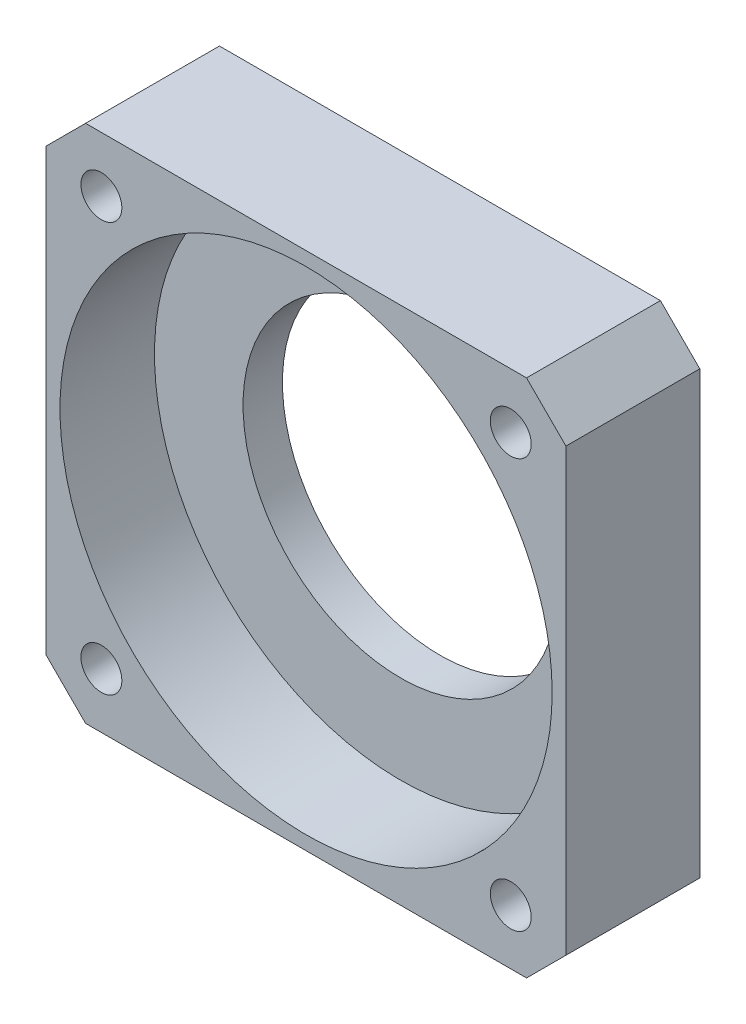
ISO-10303-21;
HEADER;
FILE_DESCRIPTION(('STEP AP214'),'2;1');
FILE_NAME('part.step','',(''),(''),'','','');
FILE_SCHEMA(('AUTOMOTIVE_DESIGN { 1 0 10303 214 1 1 1 1 }'));
ENDSEC;
DATA;
#1=APPLICATION_CONTEXT('core data for automotive mechanical design processes');
#2=APPLICATION_PROTOCOL_DEFINITION('international standard','automotive_design',2000,#1);
#3=PRODUCT_CONTEXT('',#1,'mechanical');
#4=PRODUCT('Part','Part','',(#3));
#5=PRODUCT_RELATED_PRODUCT_CATEGORY('part','',(#4));
#6=PRODUCT_DEFINITION_FORMATION('','',#4);
#7=PRODUCT_DEFINITION_CONTEXT('part definition',#1,'design');
#8=PRODUCT_DEFINITION('design','',#6,#7);
#9=PRODUCT_DEFINITION_SHAPE('','',#8);
#10=(LENGTH_UNIT() NAMED_UNIT(*) SI_UNIT(.MILLI.,.METRE.));
#11=(NAMED_UNIT(*) PLANE_ANGLE_UNIT() SI_UNIT($,.RADIAN.));
#12=(NAMED_UNIT(*) SI_UNIT($,.STERADIAN.) SOLID_ANGLE_UNIT());
#13=UNCERTAINTY_MEASURE_WITH_UNIT(LENGTH_MEASURE(1.E-05),#10,'distance_accuracy_value','');
#14=(GEOMETRIC_REPRESENTATION_CONTEXT(3) GLOBAL_UNCERTAINTY_ASSIGNED_CONTEXT((#13)) GLOBAL_UNIT_ASSIGNED_CONTEXT((#10,
#11,#12)) REPRESENTATION_CONTEXT('',''));
#15=CARTESIAN_POINT('',(0.,0.,0.));
#16=DIRECTION('',(0.,0.,1.));
#17=DIRECTION('',(1.,0.,0.));
#18=AXIS2_PLACEMENT_3D('',#15,#16,#17);
#19=CARTESIAN_POINT('',(20.955,20.955,10.795));
#20=DIRECTION('',(0.,0.,-1.));
#21=DIRECTION('',(-1.,0.,0.));
#22=AXIS2_PLACEMENT_3D('',#19,#20,#21);
#23=CYLINDRICAL_SURFACE('',#22,12.7);
#24=CARTESIAN_POINT('',(20.955,20.955,0.));
#25=DIRECTION('',(0.,0.,1.));
#26=DIRECTION('',(1.,0.,0.));
#27=AXIS2_PLACEMENT_3D('',#24,#25,#26);
#28=CIRCLE('',#27,12.7);
#29=CARTESIAN_POINT('',(33.655,20.955,0.));
#30=VERTEX_POINT('',#29);
#31=EDGE_CURVE('E187',#30,#30,#28,.T.);
#32=ORIENTED_EDGE('',*,*,#31,.F.);
#33=EDGE_LOOP('',(#32));
#34=FACE_BOUND('',#33,.T.);
#35=CARTESIAN_POINT('',(20.955,20.955,3.175));
#36=DIRECTION('',(0.,0.,1.));
#37=DIRECTION('',(1.,0.,0.));
#38=AXIS2_PLACEMENT_3D('',#35,#36,#37);
#39=CIRCLE('',#38,12.7);
#40=CARTESIAN_POINT('',(33.655,20.955,3.175));
#41=VERTEX_POINT('',#40);
#42=EDGE_CURVE('E140',#41,#41,#39,.T.);
#43=ORIENTED_EDGE('',*,*,#42,.T.);
#44=EDGE_LOOP('',(#43));
#45=FACE_BOUND('',#44,.T.);
#46=ADVANCED_FACE('F35',(#34,#45),#23,.F.);
#47=CARTESIAN_POINT('',(0.,0.,10.795));
#48=DIRECTION('',(0.,0.,-1.));
#49=DIRECTION('',(-1.,0.,0.));
#50=AXIS2_PLACEMENT_3D('',#47,#48,#49);
#51=PLANE('',#50);
#52=CARTESIAN_POINT('',(20.955,20.955,10.795));
#53=DIRECTION('',(0.,0.,1.));
#54=DIRECTION('',(1.,0.,0.));
#55=AXIS2_PLACEMENT_3D('',#52,#53,#54);
#56=CIRCLE('',#55,19.84375);
#57=CARTESIAN_POINT('',(40.79875,20.955,10.795));
#58=VERTEX_POINT('',#57);
#59=EDGE_CURVE('E209',#58,#58,#56,.T.);
#60=ORIENTED_EDGE('',*,*,#59,.F.);
#61=EDGE_LOOP('',(#60));
#62=FACE_BOUND('',#61,.T.);
#63=CARTESIAN_POINT('',(4.44928924947582,4.44928924947489,10.795));
#64=DIRECTION('',(0.,0.,1.));
#65=DIRECTION('',(1.,0.,0.));
#66=AXIS2_PLACEMENT_3D('',#63,#64,#65);
#67=CIRCLE('',#66,1.64973);
#68=CARTESIAN_POINT('',(6.09901924947582,4.44928924947489,10.795));
#69=VERTEX_POINT('',#68);
#70=EDGE_CURVE('E196',#69,#69,#67,.T.);
#71=ORIENTED_EDGE('',*,*,#70,.F.);
#72=EDGE_LOOP('',(#71));
#73=FACE_BOUND('',#72,.T.);
#74=DIRECTION('',(0.,-1.,0.));
#75=VECTOR('',#74,1.);
#76=CARTESIAN_POINT('',(0.,0.,10.795));
#77=LINE('',#76,#75);
#78=CARTESIAN_POINT('',(0.,38.735,10.795));
#79=VERTEX_POINT('',#78);
#80=CARTESIAN_POINT('',(0.,3.17500000000001,10.795));
#81=VERTEX_POINT('',#80);
#82=EDGE_CURVE('E139',#79,#81,#77,.T.);
#83=ORIENTED_EDGE('',*,*,#82,.T.);
#84=DIRECTION('',(-0.707106781186546,0.707106781186549,0.));
#85=VECTOR('',#84,1.);
#86=CARTESIAN_POINT('',(3.175,0.,10.795));
#87=LINE('',#86,#85);
#88=CARTESIAN_POINT('',(3.175,0.,10.795));
#89=VERTEX_POINT('',#88);
#90=EDGE_CURVE('E159',#81,#89,#87,.F.);
#91=ORIENTED_EDGE('',*,*,#90,.T.);
#92=DIRECTION('',(1.,0.,0.));
#93=VECTOR('',#92,1.);
#94=CARTESIAN_POINT('',(0.,0.,10.795));
#95=LINE('',#94,#93);
#96=CARTESIAN_POINT('',(38.735,0.,10.795));
#97=VERTEX_POINT('',#96);
#98=EDGE_CURVE('E121',#89,#97,#95,.T.);
#99=ORIENTED_EDGE('',*,*,#98,.T.);
#100=DIRECTION('',(-0.707106781186549,-0.707106781186546,0.));
#101=VECTOR('',#100,1.);
#102=CARTESIAN_POINT('',(41.91,3.175,10.795));
#103=LINE('',#102,#101);
#104=CARTESIAN_POINT('',(41.91,3.175,10.795));
#105=VERTEX_POINT('',#104);
#106=EDGE_CURVE('E157',#97,#105,#103,.F.);
#107=ORIENTED_EDGE('',*,*,#106,.T.);
#108=DIRECTION('',(0.,1.,0.));
#109=VECTOR('',#108,1.);
#110=CARTESIAN_POINT('',(41.91,0.,10.795));
#111=LINE('',#110,#109);
#112=CARTESIAN_POINT('',(41.91,38.735,10.795));
#113=VERTEX_POINT('',#112);
#114=EDGE_CURVE('E170',#105,#113,#111,.T.);
#115=ORIENTED_EDGE('',*,*,#114,.T.);
#116=DIRECTION('',(0.707106781186545,-0.70710678118655,0.));
#117=VECTOR('',#116,1.);
#118=CARTESIAN_POINT('',(38.735,41.91,10.795));
#119=LINE('',#118,#117);
#120=CARTESIAN_POINT('',(38.735,41.91,10.795));
#121=VERTEX_POINT('',#120);
#122=EDGE_CURVE('E56',#113,#121,#119,.F.);
#123=ORIENTED_EDGE('',*,*,#122,.T.);
#124=DIRECTION('',(-1.,0.,0.));
#125=VECTOR('',#124,1.);
#126=CARTESIAN_POINT('',(0.,41.91,10.795));
#127=LINE('',#126,#125);
#128=CARTESIAN_POINT('',(3.17500000000001,41.91,10.795));
#129=VERTEX_POINT('',#128);
#130=EDGE_CURVE('E145',#121,#129,#127,.T.);
#131=ORIENTED_EDGE('',*,*,#130,.T.);
#132=DIRECTION('',(0.70710678118655,0.707106781186545,0.));
#133=VECTOR('',#132,1.);
#134=CARTESIAN_POINT('',(0.,38.735,10.795));
#135=LINE('',#134,#133);
#136=EDGE_CURVE('E154',#129,#79,#135,.F.);
#137=ORIENTED_EDGE('',*,*,#136,.T.);
#138=EDGE_LOOP('',(#83,#91,#99,#107,#115,#123,#131,#137));
#139=FACE_BOUND('',#138,.T.);
#140=CARTESIAN_POINT('',(37.4607107505251,37.4607107505251,10.795));
#141=DIRECTION('',(0.,0.,1.));
#142=DIRECTION('',(1.,0.,0.));
#143=AXIS2_PLACEMENT_3D('',#140,#141,#142);
#144=CIRCLE('',#143,1.64973);
#145=CARTESIAN_POINT('',(39.1104407505251,37.4607107505251,10.795));
#146=VERTEX_POINT('',#145);
#147=EDGE_CURVE('E134',#146,#146,#144,.T.);
#148=ORIENTED_EDGE('',*,*,#147,.F.);
#149=EDGE_LOOP('',(#148));
#150=FACE_BOUND('',#149,.T.);
#151=CARTESIAN_POINT('',(37.4607107505255,4.44928924947537,10.795));
#152=DIRECTION('',(0.,0.,1.));
#153=DIRECTION('',(1.,0.,0.));
#154=AXIS2_PLACEMENT_3D('',#151,#152,#153);
#155=CIRCLE('',#154,1.64973);
#156=CARTESIAN_POINT('',(39.1104407505255,4.44928924947537,10.795));
#157=VERTEX_POINT('',#156);
#158=EDGE_CURVE('E192',#157,#157,#155,.T.);
#159=ORIENTED_EDGE('',*,*,#158,.F.);
#160=EDGE_LOOP('',(#159));
#161=FACE_BOUND('',#160,.T.);
#162=CARTESIAN_POINT('',(4.44928924947507,37.4607107505243,10.795));
#163=DIRECTION('',(0.,0.,1.));
#164=DIRECTION('',(1.,0.,0.));
#165=AXIS2_PLACEMENT_3D('',#162,#163,#164);
#166=CIRCLE('',#165,1.64973);
#167=CARTESIAN_POINT('',(6.09901924947507,37.4607107505243,10.795));
#168=VERTEX_POINT('',#167);
#169=EDGE_CURVE('E202',#168,#168,#166,.T.);
#170=ORIENTED_EDGE('',*,*,#169,.F.);
#171=EDGE_LOOP('',(#170));
#172=FACE_BOUND('',#171,.T.);
#173=ADVANCED_FACE('F224',(#62,#73,#139,#150,#161,#172),#51,.F.);
#174=CARTESIAN_POINT('',(0.,0.,0.));
#175=DIRECTION('',(0.,0.,-1.));
#176=DIRECTION('',(-1.,0.,0.));
#177=AXIS2_PLACEMENT_3D('',#174,#175,#176);
#178=PLANE('',#177);
#179=CARTESIAN_POINT('',(4.44928924947582,4.44928924947489,0.));
#180=DIRECTION('',(0.,0.,1.));
#181=DIRECTION('',(1.,0.,0.));
#182=AXIS2_PLACEMENT_3D('',#179,#180,#181);
#183=CIRCLE('',#182,1.64973);
#184=CARTESIAN_POINT('',(6.09901924947582,4.44928924947489,0.));
#185=VERTEX_POINT('',#184);
#186=EDGE_CURVE('E199',#185,#185,#183,.T.);
#187=ORIENTED_EDGE('',*,*,#186,.T.);
#188=EDGE_LOOP('',(#187));
#189=FACE_BOUND('',#188,.T.);
#190=ORIENTED_EDGE('',*,*,#31,.T.);
#191=EDGE_LOOP('',(#190));
#192=FACE_BOUND('',#191,.T.);
#193=DIRECTION('',(1.,0.,0.));
#194=VECTOR('',#193,1.);
#195=CARTESIAN_POINT('',(0.,0.,0.));
#196=LINE('',#195,#194);
#197=CARTESIAN_POINT('',(3.175,0.,0.));
#198=VERTEX_POINT('',#197);
#199=CARTESIAN_POINT('',(38.735,0.,0.));
#200=VERTEX_POINT('',#199);
#201=EDGE_CURVE('E118',#198,#200,#196,.T.);
#202=ORIENTED_EDGE('',*,*,#201,.F.);
#203=DIRECTION('',(0.707106781186546,-0.707106781186549,0.));
#204=VECTOR('',#203,1.);
#205=CARTESIAN_POINT('',(1.58750000000001,1.5875,0.));
#206=LINE('',#205,#204);
#207=CARTESIAN_POINT('',(0.,3.17500000000001,0.));
#208=VERTEX_POINT('',#207);
#209=EDGE_CURVE('E101',#198,#208,#206,.F.);
#210=ORIENTED_EDGE('',*,*,#209,.T.);
#211=DIRECTION('',(0.,-1.,0.));
#212=VECTOR('',#211,1.);
#213=CARTESIAN_POINT('',(0.,0.,0.));
#214=LINE('',#213,#212);
#215=CARTESIAN_POINT('',(0.,38.735,0.));
#216=VERTEX_POINT('',#215);
#217=EDGE_CURVE('E129',#216,#208,#214,.T.);
#218=ORIENTED_EDGE('',*,*,#217,.F.);
#219=DIRECTION('',(-0.70710678118655,-0.707106781186545,0.));
#220=VECTOR('',#219,1.);
#221=CARTESIAN_POINT('',(-19.3675,19.3675000000001,0.));
#222=LINE('',#221,#220);
#223=CARTESIAN_POINT('',(3.17500000000001,41.91,0.));
#224=VERTEX_POINT('',#223);
#225=EDGE_CURVE('E122',#216,#224,#222,.F.);
#226=ORIENTED_EDGE('',*,*,#225,.T.);
#227=DIRECTION('',(-1.,0.,0.));
#228=VECTOR('',#227,1.);
#229=CARTESIAN_POINT('',(0.,41.91,0.));
#230=LINE('',#229,#228);
#231=CARTESIAN_POINT('',(38.735,41.91,0.));
#232=VERTEX_POINT('',#231);
#233=EDGE_CURVE('E132',#232,#224,#230,.T.);
#234=ORIENTED_EDGE('',*,*,#233,.F.);
#235=DIRECTION('',(-0.707106781186545,0.70710678118655,0.));
#236=VECTOR('',#235,1.);
#237=CARTESIAN_POINT('',(40.3225000000001,40.3224999999999,0.));
#238=LINE('',#237,#236);
#239=CARTESIAN_POINT('',(41.91,38.735,0.));
#240=VERTEX_POINT('',#239);
#241=EDGE_CURVE('E148',#232,#240,#238,.F.);
#242=ORIENTED_EDGE('',*,*,#241,.T.);
#243=DIRECTION('',(0.,1.,0.));
#244=VECTOR('',#243,1.);
#245=CARTESIAN_POINT('',(41.91,0.,0.));
#246=LINE('',#245,#244);
#247=CARTESIAN_POINT('',(41.91,3.175,0.));
#248=VERTEX_POINT('',#247);
#249=EDGE_CURVE('E128',#248,#240,#246,.T.);
#250=ORIENTED_EDGE('',*,*,#249,.F.);
#251=DIRECTION('',(0.707106781186549,0.707106781186546,0.));
#252=VECTOR('',#251,1.);
#253=CARTESIAN_POINT('',(19.3674999999999,-19.3675,0.));
#254=LINE('',#253,#252);
#255=EDGE_CURVE('E112',#248,#200,#254,.F.);
#256=ORIENTED_EDGE('',*,*,#255,.T.);
#257=EDGE_LOOP('',(#202,#210,#218,#226,#234,#242,#250,#256));
#258=FACE_BOUND('',#257,.T.);
#259=CARTESIAN_POINT('',(37.4607107505251,37.4607107505251,0.));
#260=DIRECTION('',(0.,0.,1.));
#261=DIRECTION('',(1.,0.,0.));
#262=AXIS2_PLACEMENT_3D('',#259,#260,#261);
#263=CIRCLE('',#262,1.64973);
#264=CARTESIAN_POINT('',(39.1104407505251,37.4607107505251,0.));
#265=VERTEX_POINT('',#264);
#266=EDGE_CURVE('E184',#265,#265,#263,.T.);
#267=ORIENTED_EDGE('',*,*,#266,.T.);
#268=EDGE_LOOP('',(#267));
#269=FACE_BOUND('',#268,.T.);
#270=CARTESIAN_POINT('',(37.4607107505255,4.44928924947537,0.));
#271=DIRECTION('',(0.,0.,1.));
#272=DIRECTION('',(1.,0.,0.));
#273=AXIS2_PLACEMENT_3D('',#270,#271,#272);
#274=CIRCLE('',#273,1.64973);
#275=CARTESIAN_POINT('',(39.1104407505255,4.44928924947537,0.));
#276=VERTEX_POINT('',#275);
#277=EDGE_CURVE('E193',#276,#276,#274,.T.);
#278=ORIENTED_EDGE('',*,*,#277,.T.);
#279=EDGE_LOOP('',(#278));
#280=FACE_BOUND('',#279,.T.);
#281=CARTESIAN_POINT('',(4.44928924947507,37.4607107505243,0.));
#282=DIRECTION('',(0.,0.,1.));
#283=DIRECTION('',(1.,0.,0.));
#284=AXIS2_PLACEMENT_3D('',#281,#282,#283);
#285=CIRCLE('',#284,1.64973);
#286=CARTESIAN_POINT('',(6.09901924947507,37.4607107505243,0.));
#287=VERTEX_POINT('',#286);
#288=EDGE_CURVE('E143',#287,#287,#285,.T.);
#289=ORIENTED_EDGE('',*,*,#288,.T.);
#290=EDGE_LOOP('',(#289));
#291=FACE_BOUND('',#290,.T.);
#292=ADVANCED_FACE('F125',(#189,#192,#258,#269,#280,#291),#178,.T.);
#293=CARTESIAN_POINT('',(0.,0.,10.795));
#294=DIRECTION('',(1.,0.,0.));
#295=DIRECTION('',(0.,0.,-1.));
#296=AXIS2_PLACEMENT_3D('',#293,#294,#295);
#297=PLANE('',#296);
#298=ORIENTED_EDGE('',*,*,#217,.T.);
#299=DIRECTION('',(0.,0.,1.));
#300=VECTOR('',#299,1.);
#301=CARTESIAN_POINT('',(0.,3.17500000000001,10.795));
#302=LINE('',#301,#300);
#303=EDGE_CURVE('E106',#208,#81,#302,.T.);
#304=ORIENTED_EDGE('',*,*,#303,.T.);
#305=ORIENTED_EDGE('',*,*,#82,.F.);
#306=DIRECTION('',(0.,0.,-1.));
#307=VECTOR('',#306,1.);
#308=CARTESIAN_POINT('',(0.,38.735,10.795));
#309=LINE('',#308,#307);
#310=EDGE_CURVE('E111',#79,#216,#309,.T.);
#311=ORIENTED_EDGE('',*,*,#310,.T.);
#312=EDGE_LOOP('',(#298,#304,#305,#311));
#313=FACE_BOUND('',#312,.T.);
#314=ADVANCED_FACE('F244',(#313),#297,.F.);
#315=CARTESIAN_POINT('',(0.,0.,10.795));
#316=DIRECTION('',(0.,1.,0.));
#317=DIRECTION('',(0.,0.,1.));
#318=AXIS2_PLACEMENT_3D('',#315,#316,#317);
#319=PLANE('',#318);
#320=ORIENTED_EDGE('',*,*,#98,.F.);
#321=DIRECTION('',(0.,0.,-1.));
#322=VECTOR('',#321,1.);
#323=CARTESIAN_POINT('',(3.175,0.,10.795));
#324=LINE('',#323,#322);
#325=EDGE_CURVE('E105',#89,#198,#324,.T.);
#326=ORIENTED_EDGE('',*,*,#325,.T.);
#327=ORIENTED_EDGE('',*,*,#201,.T.);
#328=DIRECTION('',(0.,0.,1.));
#329=VECTOR('',#328,1.);
#330=CARTESIAN_POINT('',(38.735,0.,10.795));
#331=LINE('',#330,#329);
#332=EDGE_CURVE('E123',#200,#97,#331,.T.);
#333=ORIENTED_EDGE('',*,*,#332,.T.);
#334=EDGE_LOOP('',(#320,#326,#327,#333));
#335=FACE_BOUND('',#334,.T.);
#336=ADVANCED_FACE('F117',(#335),#319,.F.);
#337=CARTESIAN_POINT('',(41.91,0.,10.795));
#338=DIRECTION('',(-1.,0.,0.));
#339=DIRECTION('',(0.,0.,1.));
#340=AXIS2_PLACEMENT_3D('',#337,#338,#339);
#341=PLANE('',#340);
#342=ORIENTED_EDGE('',*,*,#114,.F.);
#343=DIRECTION('',(0.,0.,-1.));
#344=VECTOR('',#343,1.);
#345=CARTESIAN_POINT('',(41.91,3.175,10.795));
#346=LINE('',#345,#344);
#347=EDGE_CURVE('E163',#105,#248,#346,.T.);
#348=ORIENTED_EDGE('',*,*,#347,.T.);
#349=ORIENTED_EDGE('',*,*,#249,.T.);
#350=DIRECTION('',(0.,0.,1.));
#351=VECTOR('',#350,1.);
#352=CARTESIAN_POINT('',(41.91,38.735,10.795));
#353=LINE('',#352,#351);
#354=EDGE_CURVE('E161',#240,#113,#353,.T.);
#355=ORIENTED_EDGE('',*,*,#354,.T.);
#356=EDGE_LOOP('',(#342,#348,#349,#355));
#357=FACE_BOUND('',#356,.T.);
#358=ADVANCED_FACE('F168',(#357),#341,.F.);
#359=CARTESIAN_POINT('',(0.,41.91,10.795));
#360=DIRECTION('',(0.,-1.,0.));
#361=DIRECTION('',(0.,0.,-1.));
#362=AXIS2_PLACEMENT_3D('',#359,#360,#361);
#363=PLANE('',#362);
#364=ORIENTED_EDGE('',*,*,#130,.F.);
#365=DIRECTION('',(0.,0.,-1.));
#366=VECTOR('',#365,1.);
#367=CARTESIAN_POINT('',(38.735,41.91,10.795));
#368=LINE('',#367,#366);
#369=EDGE_CURVE('E11',#121,#232,#368,.T.);
#370=ORIENTED_EDGE('',*,*,#369,.T.);
#371=ORIENTED_EDGE('',*,*,#233,.T.);
#372=DIRECTION('',(0.,0.,1.));
#373=VECTOR('',#372,1.);
#374=CARTESIAN_POINT('',(3.17500000000001,41.91,10.795));
#375=LINE('',#374,#373);
#376=EDGE_CURVE('E43',#224,#129,#375,.T.);
#377=ORIENTED_EDGE('',*,*,#376,.T.);
#378=EDGE_LOOP('',(#364,#370,#371,#377));
#379=FACE_BOUND('',#378,.T.);
#380=ADVANCED_FACE('F177',(#379),#363,.F.);
#381=CARTESIAN_POINT('',(37.4607107505251,37.4607107505251,10.795));
#382=DIRECTION('',(0.,0.,-1.));
#383=DIRECTION('',(-1.,0.,0.));
#384=AXIS2_PLACEMENT_3D('',#381,#382,#383);
#385=CYLINDRICAL_SURFACE('',#384,1.64973);
#386=ORIENTED_EDGE('',*,*,#147,.T.);
#387=EDGE_LOOP('',(#386));
#388=FACE_BOUND('',#387,.T.);
#389=ORIENTED_EDGE('',*,*,#266,.F.);
#390=EDGE_LOOP('',(#389));
#391=FACE_BOUND('',#390,.T.);
#392=ADVANCED_FACE('F266',(#388,#391),#385,.F.);
#393=CARTESIAN_POINT('',(37.4607107505255,4.44928924947537,10.795));
#394=DIRECTION('',(0.,0.,-1.));
#395=DIRECTION('',(-1.,0.,0.));
#396=AXIS2_PLACEMENT_3D('',#393,#394,#395);
#397=CYLINDRICAL_SURFACE('',#396,1.64973);
#398=ORIENTED_EDGE('',*,*,#158,.T.);
#399=EDGE_LOOP('',(#398));
#400=FACE_BOUND('',#399,.T.);
#401=ORIENTED_EDGE('',*,*,#277,.F.);
#402=EDGE_LOOP('',(#401));
#403=FACE_BOUND('',#402,.T.);
#404=ADVANCED_FACE('F264',(#400,#403),#397,.F.);
#405=CARTESIAN_POINT('',(4.44928924947582,4.44928924947489,10.795));
#406=DIRECTION('',(0.,0.,-1.));
#407=DIRECTION('',(-1.,0.,0.));
#408=AXIS2_PLACEMENT_3D('',#405,#406,#407);
#409=CYLINDRICAL_SURFACE('',#408,1.64973);
#410=ORIENTED_EDGE('',*,*,#70,.T.);
#411=EDGE_LOOP('',(#410));
#412=FACE_BOUND('',#411,.T.);
#413=ORIENTED_EDGE('',*,*,#186,.F.);
#414=EDGE_LOOP('',(#413));
#415=FACE_BOUND('',#414,.T.);
#416=ADVANCED_FACE('F239',(#412,#415),#409,.F.);
#417=CARTESIAN_POINT('',(4.44928924947507,37.4607107505243,10.795));
#418=DIRECTION('',(0.,0.,-1.));
#419=DIRECTION('',(-1.,0.,0.));
#420=AXIS2_PLACEMENT_3D('',#417,#418,#419);
#421=CYLINDRICAL_SURFACE('',#420,1.64973);
#422=ORIENTED_EDGE('',*,*,#169,.T.);
#423=EDGE_LOOP('',(#422));
#424=FACE_BOUND('',#423,.T.);
#425=ORIENTED_EDGE('',*,*,#288,.F.);
#426=EDGE_LOOP('',(#425));
#427=FACE_BOUND('',#426,.T.);
#428=ADVANCED_FACE('F220',(#424,#427),#421,.F.);
#429=CARTESIAN_POINT('',(20.955,20.955,3.175));
#430=DIRECTION('',(0.,0.,1.));
#431=DIRECTION('',(1.,0.,0.));
#432=AXIS2_PLACEMENT_3D('',#429,#430,#431);
#433=CYLINDRICAL_SURFACE('',#432,19.84375);
#434=CARTESIAN_POINT('',(20.955,20.955,3.175));
#435=DIRECTION('',(0.,0.,1.));
#436=DIRECTION('',(1.,0.,0.));
#437=AXIS2_PLACEMENT_3D('',#434,#435,#436);
#438=CIRCLE('',#437,19.84375);
#439=CARTESIAN_POINT('',(40.79875,20.955,3.175));
#440=VERTEX_POINT('',#439);
#441=EDGE_CURVE('E144',#440,#440,#438,.T.);
#442=CARTESIAN_POINT('',(40.79875,20.955,3.175));
#443=CARTESIAN_POINT('',(40.79875,20.955,3.254375));
#444=CARTESIAN_POINT('',(40.79875,20.955,3.33375));
#445=CARTESIAN_POINT('',(40.79875,20.955,3.4925));
#446=CARTESIAN_POINT('',(40.79875,20.955,3.571875));
#447=CARTESIAN_POINT('',(40.79875,20.955,3.730625));
#448=CARTESIAN_POINT('',(40.79875,20.955,3.81));
#449=CARTESIAN_POINT('',(40.79875,20.955,3.96875));
#450=CARTESIAN_POINT('',(40.79875,20.955,4.048125));
#451=CARTESIAN_POINT('',(40.79875,20.955,4.206875));
#452=CARTESIAN_POINT('',(40.79875,20.955,4.28625));
#453=CARTESIAN_POINT('',(40.79875,20.955,4.445));
#454=CARTESIAN_POINT('',(40.79875,20.955,4.524375));
#455=CARTESIAN_POINT('',(40.79875,20.955,4.683125));
#456=CARTESIAN_POINT('',(40.79875,20.955,4.7625));
#457=CARTESIAN_POINT('',(40.79875,20.955,4.92125));
#458=CARTESIAN_POINT('',(40.79875,20.955,5.000625));
#459=CARTESIAN_POINT('',(40.79875,20.955,5.159375));
#460=CARTESIAN_POINT('',(40.79875,20.955,5.23875));
#461=CARTESIAN_POINT('',(40.79875,20.955,5.3975));
#462=CARTESIAN_POINT('',(40.79875,20.955,5.476875));
#463=CARTESIAN_POINT('',(40.79875,20.955,5.635625));
#464=CARTESIAN_POINT('',(40.79875,20.955,5.715));
#465=CARTESIAN_POINT('',(40.79875,20.955,5.87375));
#466=CARTESIAN_POINT('',(40.79875,20.955,5.953125));
#467=CARTESIAN_POINT('',(40.79875,20.955,6.111875));
#468=CARTESIAN_POINT('',(40.79875,20.955,6.19125));
#469=CARTESIAN_POINT('',(40.79875,20.955,6.35));
#470=CARTESIAN_POINT('',(40.79875,20.955,6.429375));
#471=CARTESIAN_POINT('',(40.79875,20.955,6.588125));
#472=CARTESIAN_POINT('',(40.79875,20.955,6.6675));
#473=CARTESIAN_POINT('',(40.79875,20.955,6.82625));
#474=CARTESIAN_POINT('',(40.79875,20.955,6.905625));
#475=CARTESIAN_POINT('',(40.79875,20.955,7.064375));
#476=CARTESIAN_POINT('',(40.79875,20.955,7.14375));
#477=CARTESIAN_POINT('',(40.79875,20.955,7.3025));
#478=CARTESIAN_POINT('',(40.79875,20.955,7.381875));
#479=CARTESIAN_POINT('',(40.79875,20.955,7.540625));
#480=CARTESIAN_POINT('',(40.79875,20.955,7.62));
#481=CARTESIAN_POINT('',(40.79875,20.955,7.77875));
#482=CARTESIAN_POINT('',(40.79875,20.955,7.858125));
#483=CARTESIAN_POINT('',(40.79875,20.955,8.016875));
#484=CARTESIAN_POINT('',(40.79875,20.955,8.09625));
#485=CARTESIAN_POINT('',(40.79875,20.955,8.255));
#486=CARTESIAN_POINT('',(40.79875,20.955,8.334375));
#487=CARTESIAN_POINT('',(40.79875,20.955,8.493125));
#488=CARTESIAN_POINT('',(40.79875,20.955,8.5725));
#489=CARTESIAN_POINT('',(40.79875,20.955,8.73125));
#490=CARTESIAN_POINT('',(40.79875,20.955,8.810625));
#491=CARTESIAN_POINT('',(40.79875,20.955,8.969375));
#492=CARTESIAN_POINT('',(40.79875,20.955,9.04875));
#493=CARTESIAN_POINT('',(40.79875,20.955,9.2075));
#494=CARTESIAN_POINT('',(40.79875,20.955,9.286875));
#495=CARTESIAN_POINT('',(40.79875,20.955,9.445625));
#496=CARTESIAN_POINT('',(40.79875,20.955,9.525));
#497=CARTESIAN_POINT('',(40.79875,20.955,9.68375));
#498=CARTESIAN_POINT('',(40.79875,20.955,9.763125));
#499=CARTESIAN_POINT('',(40.79875,20.955,9.921875));
#500=CARTESIAN_POINT('',(40.79875,20.955,10.00125));
#501=CARTESIAN_POINT('',(40.79875,20.955,10.16));
#502=CARTESIAN_POINT('',(40.79875,20.955,10.239375));
#503=CARTESIAN_POINT('',(40.79875,20.955,10.398125));
#504=CARTESIAN_POINT('',(40.79875,20.955,10.4775));
#505=CARTESIAN_POINT('',(40.79875,20.955,10.63625));
#506=CARTESIAN_POINT('',(40.79875,20.955,10.715625));
#507=CARTESIAN_POINT('',(40.79875,20.955,10.795));
#508=B_SPLINE_CURVE_WITH_KNOTS('',3,(#442,#443,#444,#445,#446,#447,#448,#449,#450,#451,#452,
#453,#454,#455,#456,#457,#458,#459,#460,#461,#462,#463,#464,#465,#466,#467,#468,#469,#470,#471,
#472,#473,#474,#475,#476,#477,#478,#479,#480,#481,#482,#483,#484,#485,#486,#487,#488,#489,#490,
#491,#492,#493,#494,#495,#496,#497,#498,#499,#500,#501,#502,#503,#504,#505,#506,#507),
.UNSPECIFIED.,.F.,.F.,(4,2,2,2,2,2,2,2,2,2,2,2,2,2,2,2,2,2,2,2,2,2,2,2,2,2,2,2,2,2,2,2,4),(0.,
0.238125,0.47625,0.714375,0.952499999999999,1.190625,1.42875,1.666875,1.905,2.143125,2.38125,
2.619375,2.8575,3.095625,3.33375,3.571875,3.81,4.048125,4.28625,4.524375,4.7625,5.000625,
5.23875,5.476875,5.715,5.953125,6.19125,6.429375,6.6675,6.905625,7.14375,7.381875,7.62),.UNSPECIFIED.);
#509=EDGE_CURVE('BSEAM217',#440,#58,#508,.T.);
#510=ORIENTED_EDGE('',*,*,#441,.F.);
#511=ORIENTED_EDGE('',*,*,#59,.T.);
#512=ORIENTED_EDGE('',*,*,#509,.T.);
#513=ORIENTED_EDGE('',*,*,#509,.F.);
#514=EDGE_LOOP('',(#510,#512,#511,#513));
#515=FACE_BOUND('',#514,.T.);
#516=ADVANCED_FACE('F217',(#515),#433,.F.);
#517=CARTESIAN_POINT('',(20.955,20.955,3.175));
#518=DIRECTION('',(0.,0.,1.));
#519=DIRECTION('',(1.,0.,0.));
#520=AXIS2_PLACEMENT_3D('',#517,#518,#519);
#521=PLANE('',#520);
#522=ORIENTED_EDGE('',*,*,#42,.F.);
#523=EDGE_LOOP('',(#522));
#524=FACE_BOUND('',#523,.T.);
#525=ORIENTED_EDGE('',*,*,#441,.T.);
#526=EDGE_LOOP('',(#525));
#527=FACE_BOUND('',#526,.T.);
#528=ADVANCED_FACE('F215',(#524,#527),#521,.T.);
#529=CARTESIAN_POINT('',(3.175,0.,10.795));
#530=DIRECTION('',(0.707106781186549,0.707106781186546,0.));
#531=DIRECTION('',(0.,0.,-1.));
#532=AXIS2_PLACEMENT_3D('',#529,#530,#531);
#533=PLANE('',#532);
#534=ORIENTED_EDGE('',*,*,#90,.F.);
#535=ORIENTED_EDGE('',*,*,#303,.F.);
#536=ORIENTED_EDGE('',*,*,#209,.F.);
#537=ORIENTED_EDGE('',*,*,#325,.F.);
#538=EDGE_LOOP('',(#534,#535,#536,#537));
#539=FACE_BOUND('',#538,.T.);
#540=ADVANCED_FACE('F104',(#539),#533,.F.);
#541=CARTESIAN_POINT('',(41.91,3.175,10.795));
#542=DIRECTION('',(-0.707106781186546,0.707106781186549,0.));
#543=DIRECTION('',(0.,0.,-1.));
#544=AXIS2_PLACEMENT_3D('',#541,#542,#543);
#545=PLANE('',#544);
#546=ORIENTED_EDGE('',*,*,#106,.F.);
#547=ORIENTED_EDGE('',*,*,#332,.F.);
#548=ORIENTED_EDGE('',*,*,#255,.F.);
#549=ORIENTED_EDGE('',*,*,#347,.F.);
#550=EDGE_LOOP('',(#546,#547,#548,#549));
#551=FACE_BOUND('',#550,.T.);
#552=ADVANCED_FACE('F289',(#551),#545,.F.);
#553=CARTESIAN_POINT('',(38.735,41.91,10.795));
#554=DIRECTION('',(-0.70710678118655,-0.707106781186545,0.));
#555=DIRECTION('',(0.,0.,-1.));
#556=AXIS2_PLACEMENT_3D('',#553,#554,#555);
#557=PLANE('',#556);
#558=ORIENTED_EDGE('',*,*,#122,.F.);
#559=ORIENTED_EDGE('',*,*,#354,.F.);
#560=ORIENTED_EDGE('',*,*,#241,.F.);
#561=ORIENTED_EDGE('',*,*,#369,.F.);
#562=EDGE_LOOP('',(#558,#559,#560,#561));
#563=FACE_BOUND('',#562,.T.);
#564=ADVANCED_FACE('F176',(#563),#557,.F.);
#565=CARTESIAN_POINT('',(0.,38.735,10.795));
#566=DIRECTION('',(0.707106781186545,-0.70710678118655,0.));
#567=DIRECTION('',(0.,0.,-1.));
#568=AXIS2_PLACEMENT_3D('',#565,#566,#567);
#569=PLANE('',#568);
#570=ORIENTED_EDGE('',*,*,#136,.F.);
#571=ORIENTED_EDGE('',*,*,#376,.F.);
#572=ORIENTED_EDGE('',*,*,#225,.F.);
#573=ORIENTED_EDGE('',*,*,#310,.F.);
#574=EDGE_LOOP('',(#570,#571,#572,#573));
#575=FACE_BOUND('',#574,.T.);
#576=ADVANCED_FACE('F37',(#575),#569,.F.);
#577=CLOSED_SHELL('',(#46,#173,#292,#314,#336,#358,#380,#392,#404,#416,#428,#516,#528,#540,#552,
#564,#576));
#578=MANIFOLD_SOLID_BREP('B2',#577);
#579=ADVANCED_BREP_SHAPE_REPRESENTATION('',(#18,#578),#14);
#580=SHAPE_DEFINITION_REPRESENTATION(#9,#579);
ENDSEC;
END-ISO-10303-21;
